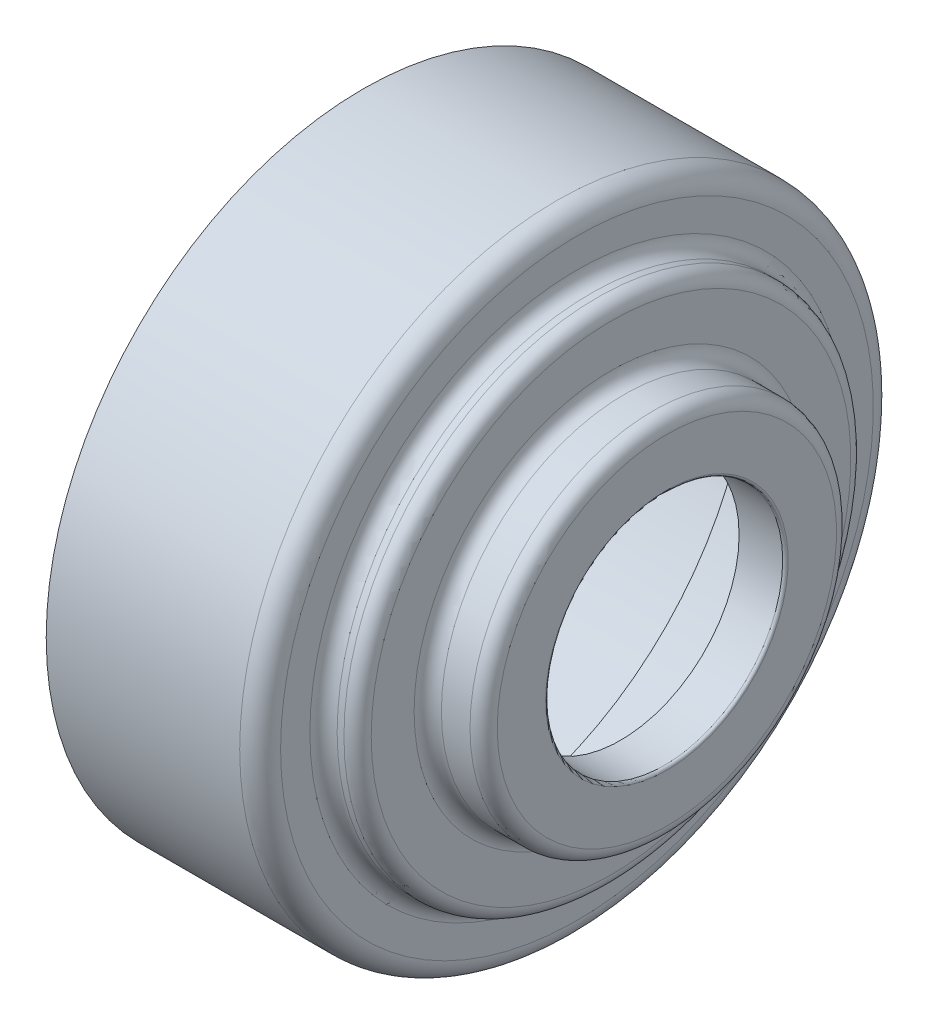
ISO-10303-21;
HEADER;
FILE_DESCRIPTION(('STEP AP214'),'2;1');
FILE_NAME('part.step','',(''),(''),'','','');
FILE_SCHEMA(('AUTOMOTIVE_DESIGN { 1 0 10303 214 1 1 1 1 }'));
ENDSEC;
DATA;
#1=APPLICATION_CONTEXT('core data for automotive mechanical design processes');
#2=APPLICATION_PROTOCOL_DEFINITION('international standard','automotive_design',2000,#1);
#3=PRODUCT_CONTEXT('',#1,'mechanical');
#4=PRODUCT('Part','Part','',(#3));
#5=PRODUCT_RELATED_PRODUCT_CATEGORY('part','',(#4));
#6=PRODUCT_DEFINITION_FORMATION('','',#4);
#7=PRODUCT_DEFINITION_CONTEXT('part definition',#1,'design');
#8=PRODUCT_DEFINITION('design','',#6,#7);
#9=PRODUCT_DEFINITION_SHAPE('','',#8);
#10=(LENGTH_UNIT() NAMED_UNIT(*) SI_UNIT(.MILLI.,.METRE.));
#11=(NAMED_UNIT(*) PLANE_ANGLE_UNIT() SI_UNIT($,.RADIAN.));
#12=(NAMED_UNIT(*) SI_UNIT($,.STERADIAN.) SOLID_ANGLE_UNIT());
#13=UNCERTAINTY_MEASURE_WITH_UNIT(LENGTH_MEASURE(1.E-05),#10,'distance_accuracy_value','');
#14=(GEOMETRIC_REPRESENTATION_CONTEXT(3) GLOBAL_UNCERTAINTY_ASSIGNED_CONTEXT((#13)) GLOBAL_UNIT_ASSIGNED_CONTEXT((#10,
#11,#12)) REPRESENTATION_CONTEXT('',''));
#15=CARTESIAN_POINT('',(0.,0.,0.));
#16=DIRECTION('',(0.,0.,1.));
#17=DIRECTION('',(1.,0.,0.));
#18=AXIS2_PLACEMENT_3D('',#15,#16,#17);
#19=CARTESIAN_POINT('',(-14.5,22.,0.));
#20=DIRECTION('',(1.,0.,0.));
#21=DIRECTION('',(0.,0.,-1.));
#22=AXIS2_PLACEMENT_3D('',#19,#20,#21);
#23=PLANE('',#22);
#24=CARTESIAN_POINT('',(-14.5,0.,0.));
#25=DIRECTION('',(-1.,0.,0.));
#26=DIRECTION('',(0.,0.,1.));
#27=AXIS2_PLACEMENT_3D('',#24,#25,#26);
#28=CIRCLE('',#27,22.);
#29=CARTESIAN_POINT('',(-14.5,0.,22.));
#30=VERTEX_POINT('',#29);
#31=EDGE_CURVE('E126',#30,#30,#28,.T.);
#32=ORIENTED_EDGE('',*,*,#31,.F.);
#33=EDGE_LOOP('',(#32));
#34=FACE_BOUND('',#33,.T.);
#35=CARTESIAN_POINT('',(-14.5,0.,0.));
#36=DIRECTION('',(-1.,0.,0.));
#37=DIRECTION('',(0.,0.,1.));
#38=AXIS2_PLACEMENT_3D('',#35,#36,#37);
#39=CIRCLE('',#38,23.25);
#40=CARTESIAN_POINT('',(-14.5,0.,23.25));
#41=VERTEX_POINT('',#40);
#42=EDGE_CURVE('E108',#41,#41,#39,.T.);
#43=ORIENTED_EDGE('',*,*,#42,.T.);
#44=EDGE_LOOP('',(#43));
#45=FACE_BOUND('',#44,.T.);
#46=ADVANCED_FACE('F34',(#34,#45),#23,.F.);
#47=CARTESIAN_POINT('',(-36.9366053169734,0.,0.));
#48=DIRECTION('',(-1.,0.,0.));
#49=DIRECTION('',(0.,0.,1.));
#50=AXIS2_PLACEMENT_3D('',#47,#48,#49);
#51=CYLINDRICAL_SURFACE('',#50,23.25);
#52=CARTESIAN_POINT('',(-0.300000000000002,0.,0.));
#53=DIRECTION('',(-1.,0.,0.));
#54=DIRECTION('',(0.,0.,1.));
#55=AXIS2_PLACEMENT_3D('',#52,#53,#54);
#56=CIRCLE('',#55,23.25);
#57=CARTESIAN_POINT('',(-0.300000000000002,0.,23.25));
#58=VERTEX_POINT('',#57);
#59=EDGE_CURVE('E49',#58,#58,#56,.T.);
#60=ORIENTED_EDGE('',*,*,#59,.T.);
#61=EDGE_LOOP('',(#60));
#62=FACE_BOUND('',#61,.T.);
#63=ORIENTED_EDGE('',*,*,#42,.F.);
#64=EDGE_LOOP('',(#63));
#65=FACE_BOUND('',#64,.T.);
#66=ADVANCED_FACE('F134',(#62,#65),#51,.T.);
#67=CARTESIAN_POINT('',(1.2,23.25,0.));
#68=DIRECTION('',(-1.,0.,0.));
#69=DIRECTION('',(0.,0.,1.));
#70=AXIS2_PLACEMENT_3D('',#67,#68,#69);
#71=PLANE('',#70);
#72=CARTESIAN_POINT('',(1.2,0.,0.));
#73=DIRECTION('',(-1.,0.,0.));
#74=DIRECTION('',(0.,0.,1.));
#75=AXIS2_PLACEMENT_3D('',#72,#73,#74);
#76=CIRCLE('',#75,21.75);
#77=CARTESIAN_POINT('',(1.2,0.,21.75));
#78=VERTEX_POINT('',#77);
#79=EDGE_CURVE('E45',#78,#78,#76,.F.);
#80=ORIENTED_EDGE('',*,*,#79,.T.);
#81=EDGE_LOOP('',(#80));
#82=FACE_BOUND('',#81,.T.);
#83=CARTESIAN_POINT('',(1.2,0.,0.));
#84=DIRECTION('',(-1.,0.,0.));
#85=DIRECTION('',(0.,0.,1.));
#86=AXIS2_PLACEMENT_3D('',#83,#84,#85);
#87=CIRCLE('',#86,19.6);
#88=CARTESIAN_POINT('',(1.2,0.,19.6));
#89=VERTEX_POINT('',#88);
#90=EDGE_CURVE('E66',#89,#89,#87,.T.);
#91=ORIENTED_EDGE('',*,*,#90,.T.);
#92=EDGE_LOOP('',(#91));
#93=FACE_BOUND('',#92,.T.);
#94=ADVANCED_FACE('F139',(#82,#93),#71,.F.);
#95=CARTESIAN_POINT('',(-36.9366053169734,0.,0.));
#96=DIRECTION('',(-1.,0.,0.));
#97=DIRECTION('',(0.,0.,1.));
#98=AXIS2_PLACEMENT_3D('',#95,#96,#97);
#99=CYLINDRICAL_SURFACE('',#98,18.6);
#100=CARTESIAN_POINT('',(2.2,0.,0.));
#101=DIRECTION('',(-1.,0.,0.));
#102=DIRECTION('',(0.,0.,1.));
#103=AXIS2_PLACEMENT_3D('',#100,#101,#102);
#104=CIRCLE('',#103,18.6);
#105=CARTESIAN_POINT('',(2.2,0.,18.6));
#106=VERTEX_POINT('',#105);
#107=EDGE_CURVE('E60',#106,#106,#104,.F.);
#108=ORIENTED_EDGE('',*,*,#107,.T.);
#109=EDGE_LOOP('',(#108));
#110=FACE_BOUND('',#109,.T.);
#111=CARTESIAN_POINT('',(2.7,0.,0.));
#112=DIRECTION('',(-1.,0.,0.));
#113=DIRECTION('',(0.,0.,1.));
#114=AXIS2_PLACEMENT_3D('',#111,#112,#113);
#115=CIRCLE('',#114,18.6);
#116=CARTESIAN_POINT('',(2.7,0.,18.6));
#117=VERTEX_POINT('',#116);
#118=EDGE_CURVE('E63',#117,#117,#115,.T.);
#119=ORIENTED_EDGE('',*,*,#118,.T.);
#120=EDGE_LOOP('',(#119));
#121=FACE_BOUND('',#120,.T.);
#122=ADVANCED_FACE('F145',(#110,#121),#99,.T.);
#123=CARTESIAN_POINT('',(3.7,18.6,0.));
#124=DIRECTION('',(-1.,0.,0.));
#125=DIRECTION('',(0.,0.,1.));
#126=AXIS2_PLACEMENT_3D('',#123,#124,#125);
#127=PLANE('',#126);
#128=CARTESIAN_POINT('',(3.7,0.,0.));
#129=DIRECTION('',(-1.,0.,0.));
#130=DIRECTION('',(0.,0.,1.));
#131=AXIS2_PLACEMENT_3D('',#128,#129,#130);
#132=CIRCLE('',#131,17.6);
#133=CARTESIAN_POINT('',(3.7,0.,17.6));
#134=VERTEX_POINT('',#133);
#135=EDGE_CURVE('E54',#134,#134,#132,.F.);
#136=ORIENTED_EDGE('',*,*,#135,.T.);
#137=EDGE_LOOP('',(#136));
#138=FACE_BOUND('',#137,.T.);
#139=CARTESIAN_POINT('',(3.7,0.,0.));
#140=DIRECTION('',(-1.,0.,0.));
#141=DIRECTION('',(0.,0.,1.));
#142=AXIS2_PLACEMENT_3D('',#139,#140,#141);
#143=CIRCLE('',#142,14.45);
#144=CARTESIAN_POINT('',(3.7,0.,14.45));
#145=VERTEX_POINT('',#144);
#146=EDGE_CURVE('E57',#145,#145,#143,.T.);
#147=ORIENTED_EDGE('',*,*,#146,.T.);
#148=EDGE_LOOP('',(#147));
#149=FACE_BOUND('',#148,.T.);
#150=ADVANCED_FACE('F290',(#138,#149),#127,.F.);
#151=CARTESIAN_POINT('',(-36.9366053169734,0.,0.));
#152=DIRECTION('',(-1.,0.,0.));
#153=DIRECTION('',(0.,0.,1.));
#154=AXIS2_PLACEMENT_3D('',#151,#152,#153);
#155=CYLINDRICAL_SURFACE('',#154,13.45);
#156=CARTESIAN_POINT('',(6.8,0.,0.));
#157=DIRECTION('',(-1.,0.,0.));
#158=DIRECTION('',(0.,0.,1.));
#159=AXIS2_PLACEMENT_3D('',#156,#157,#158);
#160=CIRCLE('',#159,13.45);
#161=CARTESIAN_POINT('',(6.8,0.,13.45));
#162=VERTEX_POINT('',#161);
#163=EDGE_CURVE('E72',#162,#162,#160,.T.);
#164=ORIENTED_EDGE('',*,*,#163,.T.);
#165=EDGE_LOOP('',(#164));
#166=FACE_BOUND('',#165,.T.);
#167=CARTESIAN_POINT('',(4.7,0.,0.));
#168=DIRECTION('',(-1.,0.,0.));
#169=DIRECTION('',(0.,0.,1.));
#170=AXIS2_PLACEMENT_3D('',#167,#168,#169);
#171=CIRCLE('',#170,13.45);
#172=CARTESIAN_POINT('',(4.7,0.,13.45));
#173=VERTEX_POINT('',#172);
#174=EDGE_CURVE('E75',#173,#173,#171,.F.);
#175=ORIENTED_EDGE('',*,*,#174,.T.);
#176=EDGE_LOOP('',(#175));
#177=FACE_BOUND('',#176,.T.);
#178=ADVANCED_FACE('F278',(#166,#177),#155,.T.);
#179=CARTESIAN_POINT('',(7.8,13.45,0.));
#180=DIRECTION('',(-1.,0.,0.));
#181=DIRECTION('',(0.,0.,1.));
#182=AXIS2_PLACEMENT_3D('',#179,#180,#181);
#183=PLANE('',#182);
#184=CARTESIAN_POINT('',(7.8,0.,0.));
#185=DIRECTION('',(-1.,0.,0.));
#186=DIRECTION('',(0.,0.,1.));
#187=AXIS2_PLACEMENT_3D('',#184,#185,#186);
#188=CIRCLE('',#187,12.45);
#189=CARTESIAN_POINT('',(7.8,0.,12.45));
#190=VERTEX_POINT('',#189);
#191=EDGE_CURVE('E69',#190,#190,#188,.F.);
#192=ORIENTED_EDGE('',*,*,#191,.T.);
#193=EDGE_LOOP('',(#192));
#194=FACE_BOUND('',#193,.T.);
#195=CARTESIAN_POINT('',(7.8,0.,0.));
#196=DIRECTION('',(-1.,0.,0.));
#197=DIRECTION('',(0.,0.,1.));
#198=AXIS2_PLACEMENT_3D('',#195,#196,#197);
#199=CIRCLE('',#198,8.9);
#200=CARTESIAN_POINT('',(7.8,0.,8.9));
#201=VERTEX_POINT('',#200);
#202=EDGE_CURVE('E99',#201,#201,#199,.T.);
#203=ORIENTED_EDGE('',*,*,#202,.T.);
#204=EDGE_LOOP('',(#203));
#205=FACE_BOUND('',#204,.T.);
#206=ADVANCED_FACE('F272',(#194,#205),#183,.F.);
#207=CARTESIAN_POINT('',(-36.9366053169734,0.,0.));
#208=DIRECTION('',(-1.,0.,0.));
#209=DIRECTION('',(0.,0.,1.));
#210=AXIS2_PLACEMENT_3D('',#207,#208,#209);
#211=CYLINDRICAL_SURFACE('',#210,8.7);
#212=CARTESIAN_POINT('',(7.6,0.,0.));
#213=DIRECTION('',(-1.,0.,0.));
#214=DIRECTION('',(0.,0.,1.));
#215=AXIS2_PLACEMENT_3D('',#212,#213,#214);
#216=CIRCLE('',#215,8.7);
#217=CARTESIAN_POINT('',(7.6,0.,8.7));
#218=VERTEX_POINT('',#217);
#219=EDGE_CURVE('E96',#218,#218,#216,.F.);
#220=ORIENTED_EDGE('',*,*,#219,.T.);
#221=EDGE_LOOP('',(#220));
#222=FACE_BOUND('',#221,.T.);
#223=CARTESIAN_POINT('',(4.4,0.,0.));
#224=DIRECTION('',(-1.,0.,0.));
#225=DIRECTION('',(0.,0.,1.));
#226=AXIS2_PLACEMENT_3D('',#223,#224,#225);
#227=CIRCLE('',#226,8.7);
#228=CARTESIAN_POINT('',(4.4,0.,8.7));
#229=VERTEX_POINT('',#228);
#230=EDGE_CURVE('E111',#229,#229,#227,.T.);
#231=ORIENTED_EDGE('',*,*,#230,.T.);
#232=EDGE_LOOP('',(#231));
#233=FACE_BOUND('',#232,.T.);
#234=ADVANCED_FACE('F277',(#222,#233),#211,.F.);
#235=CARTESIAN_POINT('',(4.4,9.4,0.));
#236=DIRECTION('',(1.,0.,0.));
#237=DIRECTION('',(0.,0.,-1.));
#238=AXIS2_PLACEMENT_3D('',#235,#236,#237);
#239=PLANE('',#238);
#240=ORIENTED_EDGE('',*,*,#230,.F.);
#241=EDGE_LOOP('',(#240));
#242=FACE_BOUND('',#241,.T.);
#243=CARTESIAN_POINT('',(4.4,0.,0.));
#244=DIRECTION('',(-1.,0.,0.));
#245=DIRECTION('',(0.,0.,1.));
#246=AXIS2_PLACEMENT_3D('',#243,#244,#245);
#247=CIRCLE('',#246,9.4);
#248=CARTESIAN_POINT('',(4.4,0.,9.4));
#249=VERTEX_POINT('',#248);
#250=EDGE_CURVE('E114',#249,#249,#247,.T.);
#251=ORIENTED_EDGE('',*,*,#250,.T.);
#252=EDGE_LOOP('',(#251));
#253=FACE_BOUND('',#252,.T.);
#254=ADVANCED_FACE('F384',(#242,#253),#239,.F.);
#255=CARTESIAN_POINT('',(-36.9366053169734,0.,0.));
#256=DIRECTION('',(-1.,0.,0.));
#257=DIRECTION('',(0.,0.,1.));
#258=AXIS2_PLACEMENT_3D('',#255,#256,#257);
#259=CYLINDRICAL_SURFACE('',#258,9.4);
#260=ORIENTED_EDGE('',*,*,#250,.F.);
#261=EDGE_LOOP('',(#260));
#262=FACE_BOUND('',#261,.T.);
#263=CARTESIAN_POINT('',(6.6,0.,0.));
#264=DIRECTION('',(-1.,0.,0.));
#265=DIRECTION('',(0.,0.,1.));
#266=AXIS2_PLACEMENT_3D('',#263,#264,#265);
#267=CIRCLE('',#266,9.4);
#268=CARTESIAN_POINT('',(6.6,0.,9.4));
#269=VERTEX_POINT('',#268);
#270=EDGE_CURVE('E117',#269,#269,#267,.T.);
#271=ORIENTED_EDGE('',*,*,#270,.T.);
#272=EDGE_LOOP('',(#271));
#273=FACE_BOUND('',#272,.T.);
#274=ADVANCED_FACE('F374',(#262,#273),#259,.T.);
#275=CARTESIAN_POINT('',(6.6,12.25,0.));
#276=DIRECTION('',(1.,0.,0.));
#277=DIRECTION('',(0.,0.,-1.));
#278=AXIS2_PLACEMENT_3D('',#275,#276,#277);
#279=PLANE('',#278);
#280=CARTESIAN_POINT('',(6.6,0.,0.));
#281=DIRECTION('',(1.,0.,0.));
#282=DIRECTION('',(0.,0.,-1.));
#283=AXIS2_PLACEMENT_3D('',#280,#281,#282);
#284=CIRCLE('',#283,12.05);
#285=CARTESIAN_POINT('',(6.6,0.,-12.05));
#286=VERTEX_POINT('',#285);
#287=EDGE_CURVE('E105',#286,#286,#284,.F.);
#288=ORIENTED_EDGE('',*,*,#287,.T.);
#289=EDGE_LOOP('',(#288));
#290=FACE_BOUND('',#289,.T.);
#291=ORIENTED_EDGE('',*,*,#270,.F.);
#292=EDGE_LOOP('',(#291));
#293=FACE_BOUND('',#292,.T.);
#294=ADVANCED_FACE('F228',(#290,#293),#279,.F.);
#295=CARTESIAN_POINT('',(-36.9366053169734,0.,0.));
#296=DIRECTION('',(-1.,0.,0.));
#297=DIRECTION('',(0.,0.,1.));
#298=AXIS2_PLACEMENT_3D('',#295,#296,#297);
#299=CYLINDRICAL_SURFACE('',#298,12.25);
#300=CARTESIAN_POINT('',(4.,0.,0.));
#301=DIRECTION('',(1.,0.,0.));
#302=DIRECTION('',(0.,0.,-1.));
#303=AXIS2_PLACEMENT_3D('',#300,#301,#302);
#304=CIRCLE('',#303,12.25);
#305=CARTESIAN_POINT('',(4.,0.,-12.25));
#306=VERTEX_POINT('',#305);
#307=EDGE_CURVE('E41',#306,#306,#304,.F.);
#308=ORIENTED_EDGE('',*,*,#307,.T.);
#309=EDGE_LOOP('',(#308));
#310=FACE_BOUND('',#309,.T.);
#311=CARTESIAN_POINT('',(6.4,0.,0.));
#312=DIRECTION('',(1.,0.,0.));
#313=DIRECTION('',(0.,0.,-1.));
#314=AXIS2_PLACEMENT_3D('',#311,#312,#313);
#315=CIRCLE('',#314,12.25);
#316=CARTESIAN_POINT('',(6.4,0.,-12.25));
#317=VERTEX_POINT('',#316);
#318=EDGE_CURVE('E102',#317,#317,#315,.T.);
#319=ORIENTED_EDGE('',*,*,#318,.T.);
#320=EDGE_LOOP('',(#319));
#321=FACE_BOUND('',#320,.T.);
#322=ADVANCED_FACE('F217',(#310,#321),#299,.F.);
#323=CARTESIAN_POINT('',(2.5,17.4,0.));
#324=DIRECTION('',(1.,0.,0.));
#325=DIRECTION('',(0.,0.,-1.));
#326=AXIS2_PLACEMENT_3D('',#323,#324,#325);
#327=PLANE('',#326);
#328=CARTESIAN_POINT('',(2.5,0.,0.));
#329=DIRECTION('',(1.,0.,0.));
#330=DIRECTION('',(0.,0.,-1.));
#331=AXIS2_PLACEMENT_3D('',#328,#329,#330);
#332=CIRCLE('',#331,13.75);
#333=CARTESIAN_POINT('',(2.5,0.,-13.75));
#334=VERTEX_POINT('',#333);
#335=EDGE_CURVE('E10',#334,#334,#332,.T.);
#336=ORIENTED_EDGE('',*,*,#335,.T.);
#337=EDGE_LOOP('',(#336));
#338=FACE_BOUND('',#337,.T.);
#339=CARTESIAN_POINT('',(2.5,0.,0.));
#340=DIRECTION('',(1.,0.,0.));
#341=DIRECTION('',(0.,0.,-1.));
#342=AXIS2_PLACEMENT_3D('',#339,#340,#341);
#343=CIRCLE('',#342,17.2);
#344=CARTESIAN_POINT('',(2.5,0.,-17.2));
#345=VERTEX_POINT('',#344);
#346=EDGE_CURVE('E93',#345,#345,#343,.F.);
#347=ORIENTED_EDGE('',*,*,#346,.T.);
#348=EDGE_LOOP('',(#347));
#349=FACE_BOUND('',#348,.T.);
#350=ADVANCED_FACE('F211',(#338,#349),#327,.F.);
#351=CARTESIAN_POINT('',(-36.9366053169734,0.,0.));
#352=DIRECTION('',(-1.,0.,0.));
#353=DIRECTION('',(0.,0.,1.));
#354=AXIS2_PLACEMENT_3D('',#351,#352,#353);
#355=CYLINDRICAL_SURFACE('',#354,17.4);
#356=CARTESIAN_POINT('',(2.3,0.,0.));
#357=DIRECTION('',(1.,0.,0.));
#358=DIRECTION('',(0.,0.,-1.));
#359=AXIS2_PLACEMENT_3D('',#356,#357,#358);
#360=CIRCLE('',#359,17.4);
#361=CARTESIAN_POINT('',(2.3,0.,-17.4));
#362=VERTEX_POINT('',#361);
#363=EDGE_CURVE('E87',#362,#362,#360,.T.);
#364=ORIENTED_EDGE('',*,*,#363,.T.);
#365=EDGE_LOOP('',(#364));
#366=FACE_BOUND('',#365,.T.);
#367=CARTESIAN_POINT('',(0.199999999999999,0.,0.));
#368=DIRECTION('',(1.,0.,0.));
#369=DIRECTION('',(0.,0.,-1.));
#370=AXIS2_PLACEMENT_3D('',#367,#368,#369);
#371=CIRCLE('',#370,17.4);
#372=CARTESIAN_POINT('',(0.199999999999999,0.,-17.4));
#373=VERTEX_POINT('',#372);
#374=EDGE_CURVE('E90',#373,#373,#371,.F.);
#375=ORIENTED_EDGE('',*,*,#374,.T.);
#376=EDGE_LOOP('',(#375));
#377=FACE_BOUND('',#376,.T.);
#378=ADVANCED_FACE('F216',(#366,#377),#355,.F.);
#379=CARTESIAN_POINT('',(0.,21.4,0.));
#380=DIRECTION('',(1.,0.,0.));
#381=DIRECTION('',(0.,0.,-1.));
#382=AXIS2_PLACEMENT_3D('',#379,#380,#381);
#383=PLANE('',#382);
#384=CARTESIAN_POINT('',(0.,0.,0.));
#385=DIRECTION('',(1.,0.,0.));
#386=DIRECTION('',(0.,0.,-1.));
#387=AXIS2_PLACEMENT_3D('',#384,#385,#386);
#388=CIRCLE('',#387,21.2);
#389=CARTESIAN_POINT('',(0.,0.,-21.2));
#390=VERTEX_POINT('',#389);
#391=EDGE_CURVE('E81',#390,#390,#388,.F.);
#392=ORIENTED_EDGE('',*,*,#391,.T.);
#393=EDGE_LOOP('',(#392));
#394=FACE_BOUND('',#393,.T.);
#395=CARTESIAN_POINT('',(0.,0.,0.));
#396=DIRECTION('',(1.,0.,0.));
#397=DIRECTION('',(0.,0.,-1.));
#398=AXIS2_PLACEMENT_3D('',#395,#396,#397);
#399=CIRCLE('',#398,17.6);
#400=CARTESIAN_POINT('',(0.,0.,-17.6));
#401=VERTEX_POINT('',#400);
#402=EDGE_CURVE('E84',#401,#401,#399,.T.);
#403=ORIENTED_EDGE('',*,*,#402,.T.);
#404=EDGE_LOOP('',(#403));
#405=FACE_BOUND('',#404,.T.);
#406=ADVANCED_FACE('F348',(#394,#405),#383,.F.);
#407=CARTESIAN_POINT('',(-36.9366053169734,0.,0.));
#408=DIRECTION('',(-1.,0.,0.));
#409=DIRECTION('',(0.,0.,1.));
#410=AXIS2_PLACEMENT_3D('',#407,#408,#409);
#411=CYLINDRICAL_SURFACE('',#410,21.4);
#412=CARTESIAN_POINT('',(-0.199999999999999,0.,0.));
#413=DIRECTION('',(1.,0.,0.));
#414=DIRECTION('',(0.,0.,-1.));
#415=AXIS2_PLACEMENT_3D('',#412,#413,#414);
#416=CIRCLE('',#415,21.4);
#417=CARTESIAN_POINT('',(-0.199999999999999,0.,-21.4));
#418=VERTEX_POINT('',#417);
#419=EDGE_CURVE('E78',#418,#418,#416,.T.);
#420=ORIENTED_EDGE('',*,*,#419,.T.);
#421=EDGE_LOOP('',(#420));
#422=FACE_BOUND('',#421,.T.);
#423=CARTESIAN_POINT('',(-7.5,0.,0.));
#424=DIRECTION('',(-1.,0.,0.));
#425=DIRECTION('',(0.,0.,1.));
#426=AXIS2_PLACEMENT_3D('',#423,#424,#425);
#427=CIRCLE('',#426,21.4);
#428=CARTESIAN_POINT('',(-7.5,0.,21.4));
#429=VERTEX_POINT('',#428);
#430=EDGE_CURVE('E120',#429,#429,#427,.T.);
#431=ORIENTED_EDGE('',*,*,#430,.T.);
#432=EDGE_LOOP('',(#431));
#433=FACE_BOUND('',#432,.T.);
#434=ADVANCED_FACE('F342',(#422,#433),#411,.F.);
#435=CARTESIAN_POINT('',(-7.5,22.,0.));
#436=DIRECTION('',(1.,0.,0.));
#437=DIRECTION('',(0.,0.,-1.));
#438=AXIS2_PLACEMENT_3D('',#435,#436,#437);
#439=PLANE('',#438);
#440=ORIENTED_EDGE('',*,*,#430,.F.);
#441=EDGE_LOOP('',(#440));
#442=FACE_BOUND('',#441,.T.);
#443=CARTESIAN_POINT('',(-7.5,0.,0.));
#444=DIRECTION('',(-1.,0.,0.));
#445=DIRECTION('',(0.,0.,1.));
#446=AXIS2_PLACEMENT_3D('',#443,#444,#445);
#447=CIRCLE('',#446,22.);
#448=CARTESIAN_POINT('',(-7.5,0.,22.));
#449=VERTEX_POINT('',#448);
#450=EDGE_CURVE('E123',#449,#449,#447,.T.);
#451=ORIENTED_EDGE('',*,*,#450,.T.);
#452=EDGE_LOOP('',(#451));
#453=FACE_BOUND('',#452,.T.);
#454=ADVANCED_FACE('F347',(#442,#453),#439,.F.);
#455=CARTESIAN_POINT('',(-36.9366053169734,0.,0.));
#456=DIRECTION('',(-1.,0.,0.));
#457=DIRECTION('',(0.,0.,1.));
#458=AXIS2_PLACEMENT_3D('',#455,#456,#457);
#459=CYLINDRICAL_SURFACE('',#458,22.);
#460=ORIENTED_EDGE('',*,*,#450,.F.);
#461=EDGE_LOOP('',(#460));
#462=FACE_BOUND('',#461,.T.);
#463=ORIENTED_EDGE('',*,*,#31,.T.);
#464=EDGE_LOOP('',(#463));
#465=FACE_BOUND('',#464,.T.);
#466=ADVANCED_FACE('F130',(#462,#465),#459,.F.);
#467=CARTESIAN_POINT('',(6.4,0.,0.));
#468=DIRECTION('',(1.,0.,0.));
#469=DIRECTION('',(0.,0.,-1.));
#470=AXIS2_PLACEMENT_3D('',#467,#468,#469);
#471=TOROIDAL_SURFACE('',#470,12.05,0.2);
#472=ORIENTED_EDGE('',*,*,#318,.F.);
#473=EDGE_LOOP('',(#472));
#474=FACE_BOUND('',#473,.T.);
#475=ORIENTED_EDGE('',*,*,#287,.F.);
#476=EDGE_LOOP('',(#475));
#477=FACE_BOUND('',#476,.T.);
#478=ADVANCED_FACE('F150',(#474,#477),#471,.F.);
#479=CARTESIAN_POINT('',(7.6,0.,0.));
#480=DIRECTION('',(-1.,0.,0.));
#481=DIRECTION('',(0.,0.,1.));
#482=AXIS2_PLACEMENT_3D('',#479,#480,#481);
#483=TOROIDAL_SURFACE('',#482,8.9,0.2);
#484=ORIENTED_EDGE('',*,*,#219,.F.);
#485=EDGE_LOOP('',(#484));
#486=FACE_BOUND('',#485,.T.);
#487=ORIENTED_EDGE('',*,*,#202,.F.);
#488=EDGE_LOOP('',(#487));
#489=FACE_BOUND('',#488,.T.);
#490=ADVANCED_FACE('F153',(#486,#489),#483,.T.);
#491=CARTESIAN_POINT('',(2.3,0.,0.));
#492=DIRECTION('',(1.,0.,0.));
#493=DIRECTION('',(0.,0.,-1.));
#494=AXIS2_PLACEMENT_3D('',#491,#492,#493);
#495=TOROIDAL_SURFACE('',#494,17.2,0.2);
#496=ORIENTED_EDGE('',*,*,#363,.F.);
#497=EDGE_LOOP('',(#496));
#498=FACE_BOUND('',#497,.T.);
#499=ORIENTED_EDGE('',*,*,#346,.F.);
#500=EDGE_LOOP('',(#499));
#501=FACE_BOUND('',#500,.T.);
#502=ADVANCED_FACE('F157',(#498,#501),#495,.F.);
#503=CARTESIAN_POINT('',(-0.199999999999999,0.,0.));
#504=DIRECTION('',(1.,0.,0.));
#505=DIRECTION('',(0.,0.,-1.));
#506=AXIS2_PLACEMENT_3D('',#503,#504,#505);
#507=TOROIDAL_SURFACE('',#506,21.2,0.2);
#508=ORIENTED_EDGE('',*,*,#419,.F.);
#509=EDGE_LOOP('',(#508));
#510=FACE_BOUND('',#509,.T.);
#511=ORIENTED_EDGE('',*,*,#391,.F.);
#512=EDGE_LOOP('',(#511));
#513=FACE_BOUND('',#512,.T.);
#514=ADVANCED_FACE('F161',(#510,#513),#507,.F.);
#515=CARTESIAN_POINT('',(0.199999999999999,0.,0.));
#516=DIRECTION('',(1.,0.,0.));
#517=DIRECTION('',(0.,0.,-1.));
#518=AXIS2_PLACEMENT_3D('',#515,#516,#517);
#519=TOROIDAL_SURFACE('',#518,17.6,0.2);
#520=ORIENTED_EDGE('',*,*,#402,.F.);
#521=EDGE_LOOP('',(#520));
#522=FACE_BOUND('',#521,.T.);
#523=ORIENTED_EDGE('',*,*,#374,.F.);
#524=EDGE_LOOP('',(#523));
#525=FACE_BOUND('',#524,.T.);
#526=ADVANCED_FACE('F165',(#522,#525),#519,.T.);
#527=CARTESIAN_POINT('',(6.8,0.,0.));
#528=DIRECTION('',(-1.,0.,0.));
#529=DIRECTION('',(0.,0.,1.));
#530=AXIS2_PLACEMENT_3D('',#527,#528,#529);
#531=TOROIDAL_SURFACE('',#530,12.45,1.);
#532=ORIENTED_EDGE('',*,*,#191,.F.);
#533=EDGE_LOOP('',(#532));
#534=FACE_BOUND('',#533,.T.);
#535=ORIENTED_EDGE('',*,*,#163,.F.);
#536=EDGE_LOOP('',(#535));
#537=FACE_BOUND('',#536,.T.);
#538=ADVANCED_FACE('F169',(#534,#537),#531,.T.);
#539=CARTESIAN_POINT('',(2.2,0.,0.));
#540=DIRECTION('',(-1.,0.,0.));
#541=DIRECTION('',(0.,0.,1.));
#542=AXIS2_PLACEMENT_3D('',#539,#540,#541);
#543=TOROIDAL_SURFACE('',#542,19.6,1.);
#544=ORIENTED_EDGE('',*,*,#107,.F.);
#545=EDGE_LOOP('',(#544));
#546=FACE_BOUND('',#545,.T.);
#547=ORIENTED_EDGE('',*,*,#90,.F.);
#548=EDGE_LOOP('',(#547));
#549=FACE_BOUND('',#548,.T.);
#550=ADVANCED_FACE('F173',(#546,#549),#543,.F.);
#551=CARTESIAN_POINT('',(2.7,0.,0.));
#552=DIRECTION('',(-1.,0.,0.));
#553=DIRECTION('',(0.,0.,1.));
#554=AXIS2_PLACEMENT_3D('',#551,#552,#553);
#555=TOROIDAL_SURFACE('',#554,17.6,1.);
#556=ORIENTED_EDGE('',*,*,#135,.F.);
#557=EDGE_LOOP('',(#556));
#558=FACE_BOUND('',#557,.T.);
#559=ORIENTED_EDGE('',*,*,#118,.F.);
#560=EDGE_LOOP('',(#559));
#561=FACE_BOUND('',#560,.T.);
#562=ADVANCED_FACE('F177',(#558,#561),#555,.T.);
#563=CARTESIAN_POINT('',(4.7,0.,0.));
#564=DIRECTION('',(-1.,0.,0.));
#565=DIRECTION('',(0.,0.,1.));
#566=AXIS2_PLACEMENT_3D('',#563,#564,#565);
#567=TOROIDAL_SURFACE('',#566,14.45,1.);
#568=ORIENTED_EDGE('',*,*,#174,.F.);
#569=EDGE_LOOP('',(#568));
#570=FACE_BOUND('',#569,.T.);
#571=ORIENTED_EDGE('',*,*,#146,.F.);
#572=EDGE_LOOP('',(#571));
#573=FACE_BOUND('',#572,.T.);
#574=ADVANCED_FACE('F181',(#570,#573),#567,.F.);
#575=CARTESIAN_POINT('',(-0.300000000000002,0.,0.));
#576=DIRECTION('',(-1.,0.,0.));
#577=DIRECTION('',(0.,0.,1.));
#578=AXIS2_PLACEMENT_3D('',#575,#576,#577);
#579=TOROIDAL_SURFACE('',#578,21.75,1.5);
#580=ORIENTED_EDGE('',*,*,#79,.F.);
#581=EDGE_LOOP('',(#580));
#582=FACE_BOUND('',#581,.T.);
#583=ORIENTED_EDGE('',*,*,#59,.F.);
#584=EDGE_LOOP('',(#583));
#585=FACE_BOUND('',#584,.T.);
#586=ADVANCED_FACE('F184',(#582,#585),#579,.T.);
#587=CARTESIAN_POINT('',(4.,0.,0.));
#588=DIRECTION('',(1.,0.,0.));
#589=DIRECTION('',(0.,0.,-1.));
#590=AXIS2_PLACEMENT_3D('',#587,#588,#589);
#591=TOROIDAL_SURFACE('',#590,13.75,1.5);
#592=ORIENTED_EDGE('',*,*,#335,.F.);
#593=EDGE_LOOP('',(#592));
#594=FACE_BOUND('',#593,.T.);
#595=ORIENTED_EDGE('',*,*,#307,.F.);
#596=EDGE_LOOP('',(#595));
#597=FACE_BOUND('',#596,.T.);
#598=ADVANCED_FACE('F36',(#594,#597),#591,.T.);
#599=CLOSED_SHELL('',(#46,#66,#94,#122,#150,#178,#206,#234,#254,#274,#294,#322,#350,#378,#406,
#434,#454,#466,#478,#490,#502,#514,#526,#538,#550,#562,#574,#586,#598));
#600=MANIFOLD_SOLID_BREP('B2',#599);
#601=ADVANCED_BREP_SHAPE_REPRESENTATION('',(#18,#600),#14);
#602=SHAPE_DEFINITION_REPRESENTATION(#9,#601);
ENDSEC;
END-ISO-10303-21;
